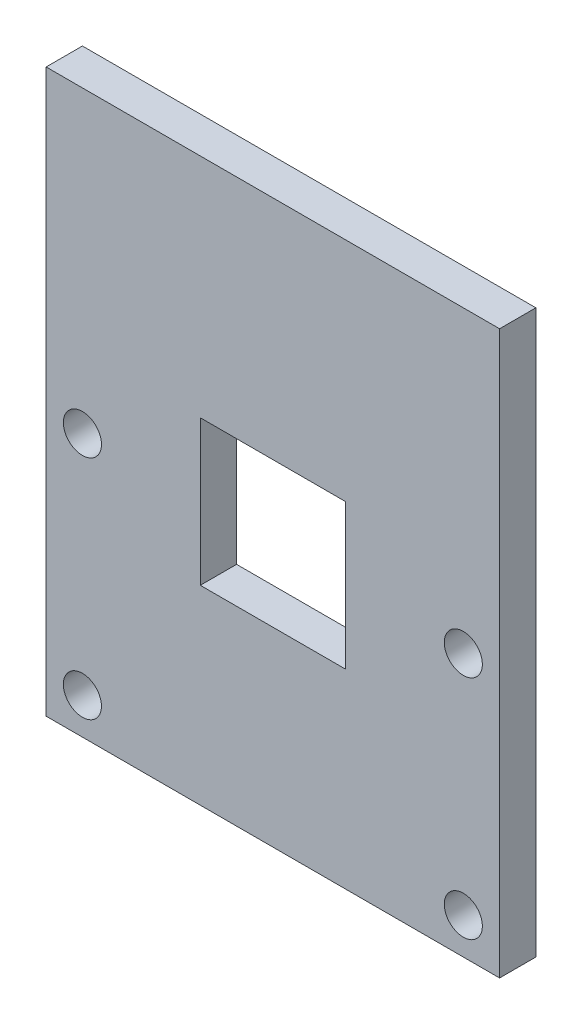
ISO-10303-21;
HEADER;
FILE_DESCRIPTION(('STEP AP214'),'2;1');
FILE_NAME('part.step','',(''),(''),'','','');
FILE_SCHEMA(('AUTOMOTIVE_DESIGN { 1 0 10303 214 1 1 1 1 }'));
ENDSEC;
DATA;
#1=APPLICATION_CONTEXT('core data for automotive mechanical design processes');
#2=APPLICATION_PROTOCOL_DEFINITION('international standard','automotive_design',2000,#1);
#3=PRODUCT_CONTEXT('',#1,'mechanical');
#4=PRODUCT('Part','Part','',(#3));
#5=PRODUCT_RELATED_PRODUCT_CATEGORY('part','',(#4));
#6=PRODUCT_DEFINITION_FORMATION('','',#4);
#7=PRODUCT_DEFINITION_CONTEXT('part definition',#1,'design');
#8=PRODUCT_DEFINITION('design','',#6,#7);
#9=PRODUCT_DEFINITION_SHAPE('','',#8);
#10=(LENGTH_UNIT() NAMED_UNIT(*) SI_UNIT(.MILLI.,.METRE.));
#11=(NAMED_UNIT(*) PLANE_ANGLE_UNIT() SI_UNIT($,.RADIAN.));
#12=(NAMED_UNIT(*) SI_UNIT($,.STERADIAN.) SOLID_ANGLE_UNIT());
#13=UNCERTAINTY_MEASURE_WITH_UNIT(LENGTH_MEASURE(1.E-05),#10,'distance_accuracy_value','');
#14=(GEOMETRIC_REPRESENTATION_CONTEXT(3) GLOBAL_UNCERTAINTY_ASSIGNED_CONTEXT((#13)) GLOBAL_UNIT_ASSIGNED_CONTEXT((#10,
#11,#12)) REPRESENTATION_CONTEXT('',''));
#15=CARTESIAN_POINT('',(0.,0.,0.));
#16=DIRECTION('',(0.,0.,1.));
#17=DIRECTION('',(1.,0.,0.));
#18=AXIS2_PLACEMENT_3D('',#15,#16,#17);
#19=CARTESIAN_POINT('',(0.,0.,2.));
#20=DIRECTION('',(0.,0.,1.));
#21=DIRECTION('',(1.,0.,0.));
#22=AXIS2_PLACEMENT_3D('',#19,#20,#21);
#23=PLANE('',#22);
#24=CARTESIAN_POINT('',(-30.2508523446474,-34.4951634409622,2.));
#25=DIRECTION('',(0.,0.,1.));
#26=DIRECTION('',(1.,0.,0.));
#27=AXIS2_PLACEMENT_3D('',#24,#25,#26);
#28=CIRCLE('',#27,1.05);
#29=CARTESIAN_POINT('',(-29.2008523446474,-34.4951634409622,2.));
#30=VERTEX_POINT('',#29);
#31=EDGE_CURVE('E161',#30,#30,#28,.T.);
#32=ORIENTED_EDGE('',*,*,#31,.F.);
#33=EDGE_LOOP('',(#32));
#34=FACE_BOUND('',#33,.T.);
#35=CARTESIAN_POINT('',(-30.2508523446474,-46.9951634409622,2.));
#36=DIRECTION('',(0.,0.,1.));
#37=DIRECTION('',(1.,0.,0.));
#38=AXIS2_PLACEMENT_3D('',#35,#36,#37);
#39=CIRCLE('',#38,1.05);
#40=CARTESIAN_POINT('',(-29.2008523446474,-46.9951634409622,2.));
#41=VERTEX_POINT('',#40);
#42=EDGE_CURVE('E177',#41,#41,#39,.T.);
#43=ORIENTED_EDGE('',*,*,#42,.F.);
#44=EDGE_LOOP('',(#43));
#45=FACE_BOUND('',#44,.T.);
#46=DIRECTION('',(0.,-1.,0.));
#47=VECTOR('',#46,1.);
#48=CARTESIAN_POINT('',(-32.2508523446474,-17.9951634409622,2.));
#49=LINE('',#48,#47);
#50=CARTESIAN_POINT('',(-32.2508523446474,-17.9951634409622,2.));
#51=VERTEX_POINT('',#50);
#52=CARTESIAN_POINT('',(-32.2508523446474,-48.9951634409622,2.));
#53=VERTEX_POINT('',#52);
#54=EDGE_CURVE('E185',#51,#53,#49,.T.);
#55=ORIENTED_EDGE('',*,*,#54,.T.);
#56=DIRECTION('',(1.,0.,0.));
#57=VECTOR('',#56,1.);
#58=CARTESIAN_POINT('',(-32.2508523446474,-48.9951634409622,2.));
#59=LINE('',#58,#57);
#60=CARTESIAN_POINT('',(-7.25085234464735,-48.9951634409622,2.));
#61=VERTEX_POINT('',#60);
#62=EDGE_CURVE('E189',#53,#61,#59,.T.);
#63=ORIENTED_EDGE('',*,*,#62,.T.);
#64=DIRECTION('',(0.,1.,0.));
#65=VECTOR('',#64,1.);
#66=CARTESIAN_POINT('',(-7.25085234464736,-17.9951634409622,2.));
#67=LINE('',#66,#65);
#68=CARTESIAN_POINT('',(-7.25085234464736,-17.9951634409622,2.));
#69=VERTEX_POINT('',#68);
#70=EDGE_CURVE('E193',#61,#69,#67,.T.);
#71=ORIENTED_EDGE('',*,*,#70,.T.);
#72=DIRECTION('',(-1.,0.,0.));
#73=VECTOR('',#72,1.);
#74=CARTESIAN_POINT('',(-32.2508523446474,-17.9951634409622,2.));
#75=LINE('',#74,#73);
#76=EDGE_CURVE('E196',#69,#51,#75,.T.);
#77=ORIENTED_EDGE('',*,*,#76,.T.);
#78=EDGE_LOOP('',(#55,#63,#71,#77));
#79=FACE_BOUND('',#78,.T.);
#80=CARTESIAN_POINT('',(-9.25085234464735,-46.9951634409622,2.));
#81=DIRECTION('',(0.,0.,1.));
#82=DIRECTION('',(1.,0.,0.));
#83=AXIS2_PLACEMENT_3D('',#80,#81,#82);
#84=CIRCLE('',#83,1.05);
#85=CARTESIAN_POINT('',(-8.20085234464735,-46.9951634409622,2.));
#86=VERTEX_POINT('',#85);
#87=EDGE_CURVE('E169',#86,#86,#84,.T.);
#88=ORIENTED_EDGE('',*,*,#87,.F.);
#89=EDGE_LOOP('',(#88));
#90=FACE_BOUND('',#89,.T.);
#91=CARTESIAN_POINT('',(-9.25085234464735,-34.4951634409622,2.));
#92=DIRECTION('',(0.,0.,1.));
#93=DIRECTION('',(1.,0.,0.));
#94=AXIS2_PLACEMENT_3D('',#91,#92,#93);
#95=CIRCLE('',#94,1.05);
#96=CARTESIAN_POINT('',(-8.20085234464735,-34.4951634409622,2.));
#97=VERTEX_POINT('',#96);
#98=EDGE_CURVE('E153',#97,#97,#95,.T.);
#99=ORIENTED_EDGE('',*,*,#98,.F.);
#100=EDGE_LOOP('',(#99));
#101=FACE_BOUND('',#100,.T.);
#102=DIRECTION('',(1.,0.,0.));
#103=VECTOR('',#102,1.);
#104=CARTESIAN_POINT('',(-23.7508523446474,-38.4951634409622,2.));
#105=LINE('',#104,#103);
#106=CARTESIAN_POINT('',(-23.7508523446474,-38.4951634409622,2.));
#107=VERTEX_POINT('',#106);
#108=CARTESIAN_POINT('',(-15.7508523446474,-38.4951634409622,2.));
#109=VERTEX_POINT('',#108);
#110=EDGE_CURVE('E114',#107,#109,#105,.T.);
#111=ORIENTED_EDGE('',*,*,#110,.F.);
#112=DIRECTION('',(0.,-1.,0.));
#113=VECTOR('',#112,1.);
#114=CARTESIAN_POINT('',(-23.7508523446474,-30.4951634409622,2.));
#115=LINE('',#114,#113);
#116=CARTESIAN_POINT('',(-23.7508523446474,-30.4951634409622,2.));
#117=VERTEX_POINT('',#116);
#118=EDGE_CURVE('E105',#117,#107,#115,.T.);
#119=ORIENTED_EDGE('',*,*,#118,.F.);
#120=DIRECTION('',(-1.,0.,0.));
#121=VECTOR('',#120,1.);
#122=CARTESIAN_POINT('',(-23.7508523446474,-30.4951634409622,2.));
#123=LINE('',#122,#121);
#124=CARTESIAN_POINT('',(-15.7508523446474,-30.4951634409622,2.));
#125=VERTEX_POINT('',#124);
#126=EDGE_CURVE('E131',#125,#117,#123,.T.);
#127=ORIENTED_EDGE('',*,*,#126,.F.);
#128=DIRECTION('',(0.,1.,0.));
#129=VECTOR('',#128,1.);
#130=CARTESIAN_POINT('',(-15.7508523446474,-30.4951634409622,2.));
#131=LINE('',#130,#129);
#132=EDGE_CURVE('E127',#109,#125,#131,.T.);
#133=ORIENTED_EDGE('',*,*,#132,.F.);
#134=EDGE_LOOP('',(#111,#119,#127,#133));
#135=FACE_BOUND('',#134,.T.);
#136=ADVANCED_FACE('F39',(#34,#45,#79,#90,#101,#135),#23,.T.);
#137=CARTESIAN_POINT('',(0.,0.,0.));
#138=DIRECTION('',(0.,0.,1.));
#139=DIRECTION('',(1.,0.,0.));
#140=AXIS2_PLACEMENT_3D('',#137,#138,#139);
#141=PLANE('',#140);
#142=CARTESIAN_POINT('',(-9.25085234464735,-34.4951634409622,0.));
#143=DIRECTION('',(0.,0.,1.));
#144=DIRECTION('',(1.,0.,0.));
#145=AXIS2_PLACEMENT_3D('',#142,#143,#144);
#146=CIRCLE('',#145,1.05);
#147=CARTESIAN_POINT('',(-8.20085234464735,-34.4951634409622,0.));
#148=VERTEX_POINT('',#147);
#149=EDGE_CURVE('E123',#148,#148,#146,.T.);
#150=ORIENTED_EDGE('',*,*,#149,.T.);
#151=EDGE_LOOP('',(#150));
#152=FACE_BOUND('',#151,.T.);
#153=CARTESIAN_POINT('',(-30.2508523446474,-34.4951634409622,0.));
#154=DIRECTION('',(0.,0.,1.));
#155=DIRECTION('',(1.,0.,0.));
#156=AXIS2_PLACEMENT_3D('',#153,#154,#155);
#157=CIRCLE('',#156,1.05);
#158=CARTESIAN_POINT('',(-29.2008523446474,-34.4951634409622,0.));
#159=VERTEX_POINT('',#158);
#160=EDGE_CURVE('E157',#159,#159,#157,.T.);
#161=ORIENTED_EDGE('',*,*,#160,.T.);
#162=EDGE_LOOP('',(#161));
#163=FACE_BOUND('',#162,.T.);
#164=CARTESIAN_POINT('',(-9.25085234464735,-46.9951634409622,0.));
#165=DIRECTION('',(0.,0.,1.));
#166=DIRECTION('',(1.,0.,0.));
#167=AXIS2_PLACEMENT_3D('',#164,#165,#166);
#168=CIRCLE('',#167,1.05);
#169=CARTESIAN_POINT('',(-8.20085234464735,-46.9951634409622,0.));
#170=VERTEX_POINT('',#169);
#171=EDGE_CURVE('E165',#170,#170,#168,.T.);
#172=ORIENTED_EDGE('',*,*,#171,.T.);
#173=EDGE_LOOP('',(#172));
#174=FACE_BOUND('',#173,.T.);
#175=CARTESIAN_POINT('',(-30.2508523446474,-46.9951634409622,0.));
#176=DIRECTION('',(0.,0.,1.));
#177=DIRECTION('',(1.,0.,0.));
#178=AXIS2_PLACEMENT_3D('',#175,#176,#177);
#179=CIRCLE('',#178,1.05);
#180=CARTESIAN_POINT('',(-29.2008523446474,-46.9951634409622,0.));
#181=VERTEX_POINT('',#180);
#182=EDGE_CURVE('E173',#181,#181,#179,.T.);
#183=ORIENTED_EDGE('',*,*,#182,.T.);
#184=EDGE_LOOP('',(#183));
#185=FACE_BOUND('',#184,.T.);
#186=DIRECTION('',(0.,-1.,0.));
#187=VECTOR('',#186,1.);
#188=CARTESIAN_POINT('',(-32.2508523446474,-17.9951634409622,0.));
#189=LINE('',#188,#187);
#190=CARTESIAN_POINT('',(-32.2508523446474,-17.9951634409622,0.));
#191=VERTEX_POINT('',#190);
#192=CARTESIAN_POINT('',(-32.2508523446474,-48.9951634409622,0.));
#193=VERTEX_POINT('',#192);
#194=EDGE_CURVE('E181',#191,#193,#189,.T.);
#195=ORIENTED_EDGE('',*,*,#194,.F.);
#196=DIRECTION('',(-1.,0.,0.));
#197=VECTOR('',#196,1.);
#198=CARTESIAN_POINT('',(-32.2508523446474,-17.9951634409622,0.));
#199=LINE('',#198,#197);
#200=CARTESIAN_POINT('',(-7.25085234464736,-17.9951634409622,0.));
#201=VERTEX_POINT('',#200);
#202=EDGE_CURVE('E190',#201,#191,#199,.T.);
#203=ORIENTED_EDGE('',*,*,#202,.F.);
#204=DIRECTION('',(0.,1.,0.));
#205=VECTOR('',#204,1.);
#206=CARTESIAN_POINT('',(-7.25085234464736,-17.9951634409622,0.));
#207=LINE('',#206,#205);
#208=CARTESIAN_POINT('',(-7.25085234464735,-48.9951634409622,0.));
#209=VERTEX_POINT('',#208);
#210=EDGE_CURVE('E206',#209,#201,#207,.T.);
#211=ORIENTED_EDGE('',*,*,#210,.F.);
#212=DIRECTION('',(1.,0.,0.));
#213=VECTOR('',#212,1.);
#214=CARTESIAN_POINT('',(-32.2508523446474,-48.9951634409622,0.));
#215=LINE('',#214,#213);
#216=EDGE_CURVE('E203',#193,#209,#215,.T.);
#217=ORIENTED_EDGE('',*,*,#216,.F.);
#218=EDGE_LOOP('',(#195,#203,#211,#217));
#219=FACE_BOUND('',#218,.T.);
#220=DIRECTION('',(0.,-1.,0.));
#221=VECTOR('',#220,1.);
#222=CARTESIAN_POINT('',(-23.7508523446474,-30.4951634409622,0.));
#223=LINE('',#222,#221);
#224=CARTESIAN_POINT('',(-23.7508523446474,-30.4951634409622,0.));
#225=VERTEX_POINT('',#224);
#226=CARTESIAN_POINT('',(-23.7508523446474,-38.4951634409622,0.));
#227=VERTEX_POINT('',#226);
#228=EDGE_CURVE('E63',#225,#227,#223,.T.);
#229=ORIENTED_EDGE('',*,*,#228,.T.);
#230=DIRECTION('',(1.,0.,0.));
#231=VECTOR('',#230,1.);
#232=CARTESIAN_POINT('',(-23.7508523446474,-38.4951634409622,0.));
#233=LINE('',#232,#231);
#234=CARTESIAN_POINT('',(-15.7508523446474,-38.4951634409622,0.));
#235=VERTEX_POINT('',#234);
#236=EDGE_CURVE('E121',#227,#235,#233,.T.);
#237=ORIENTED_EDGE('',*,*,#236,.T.);
#238=DIRECTION('',(0.,1.,0.));
#239=VECTOR('',#238,1.);
#240=CARTESIAN_POINT('',(-15.7508523446474,-30.4951634409622,0.));
#241=LINE('',#240,#239);
#242=CARTESIAN_POINT('',(-15.7508523446474,-30.4951634409622,0.));
#243=VERTEX_POINT('',#242);
#244=EDGE_CURVE('E140',#235,#243,#241,.T.);
#245=ORIENTED_EDGE('',*,*,#244,.T.);
#246=DIRECTION('',(-1.,0.,0.));
#247=VECTOR('',#246,1.);
#248=CARTESIAN_POINT('',(-23.7508523446474,-30.4951634409622,0.));
#249=LINE('',#248,#247);
#250=EDGE_CURVE('E115',#243,#225,#249,.T.);
#251=ORIENTED_EDGE('',*,*,#250,.T.);
#252=EDGE_LOOP('',(#229,#237,#245,#251));
#253=FACE_BOUND('',#252,.T.);
#254=ADVANCED_FACE('F229',(#152,#163,#174,#185,#219,#253),#141,.F.);
#255=CARTESIAN_POINT('',(-32.2508523446474,-17.9951634409622,2.));
#256=DIRECTION('',(1.,0.,0.));
#257=DIRECTION('',(0.,1.,0.));
#258=AXIS2_PLACEMENT_3D('',#255,#256,#257);
#259=PLANE('',#258);
#260=ORIENTED_EDGE('',*,*,#194,.T.);
#261=DIRECTION('',(0.,0.,-1.));
#262=VECTOR('',#261,1.);
#263=CARTESIAN_POINT('',(-32.2508523446474,-48.9951634409622,2.));
#264=LINE('',#263,#262);
#265=EDGE_CURVE('E11',#53,#193,#264,.T.);
#266=ORIENTED_EDGE('',*,*,#265,.F.);
#267=ORIENTED_EDGE('',*,*,#54,.F.);
#268=DIRECTION('',(0.,0.,-1.));
#269=VECTOR('',#268,1.);
#270=CARTESIAN_POINT('',(-32.2508523446474,-17.9951634409622,2.));
#271=LINE('',#270,#269);
#272=EDGE_CURVE('E199',#51,#191,#271,.T.);
#273=ORIENTED_EDGE('',*,*,#272,.T.);
#274=EDGE_LOOP('',(#260,#266,#267,#273));
#275=FACE_BOUND('',#274,.T.);
#276=ADVANCED_FACE('F41',(#275),#259,.F.);
#277=CARTESIAN_POINT('',(-32.2508523446474,-48.9951634409622,2.));
#278=DIRECTION('',(0.,1.,0.));
#279=DIRECTION('',(0.,0.,1.));
#280=AXIS2_PLACEMENT_3D('',#277,#278,#279);
#281=PLANE('',#280);
#282=ORIENTED_EDGE('',*,*,#216,.T.);
#283=DIRECTION('',(0.,0.,-1.));
#284=VECTOR('',#283,1.);
#285=CARTESIAN_POINT('',(-7.25085234464735,-48.9951634409622,2.));
#286=LINE('',#285,#284);
#287=EDGE_CURVE('E48',#61,#209,#286,.T.);
#288=ORIENTED_EDGE('',*,*,#287,.F.);
#289=ORIENTED_EDGE('',*,*,#62,.F.);
#290=ORIENTED_EDGE('',*,*,#265,.T.);
#291=EDGE_LOOP('',(#282,#288,#289,#290));
#292=FACE_BOUND('',#291,.T.);
#293=ADVANCED_FACE('F240',(#292),#281,.F.);
#294=CARTESIAN_POINT('',(-7.25085234464736,-17.9951634409622,2.));
#295=DIRECTION('',(-1.,0.,0.));
#296=DIRECTION('',(0.,-1.,0.));
#297=AXIS2_PLACEMENT_3D('',#294,#295,#296);
#298=PLANE('',#297);
#299=ORIENTED_EDGE('',*,*,#210,.T.);
#300=DIRECTION('',(0.,0.,-1.));
#301=VECTOR('',#300,1.);
#302=CARTESIAN_POINT('',(-7.25085234464736,-17.9951634409622,2.));
#303=LINE('',#302,#301);
#304=EDGE_CURVE('E214',#69,#201,#303,.T.);
#305=ORIENTED_EDGE('',*,*,#304,.F.);
#306=ORIENTED_EDGE('',*,*,#70,.F.);
#307=ORIENTED_EDGE('',*,*,#287,.T.);
#308=EDGE_LOOP('',(#299,#305,#306,#307));
#309=FACE_BOUND('',#308,.T.);
#310=ADVANCED_FACE('F223',(#309),#298,.F.);
#311=CARTESIAN_POINT('',(-32.2508523446474,-17.9951634409622,2.));
#312=DIRECTION('',(0.,-1.,0.));
#313=DIRECTION('',(0.,0.,-1.));
#314=AXIS2_PLACEMENT_3D('',#311,#312,#313);
#315=PLANE('',#314);
#316=ORIENTED_EDGE('',*,*,#202,.T.);
#317=ORIENTED_EDGE('',*,*,#272,.F.);
#318=ORIENTED_EDGE('',*,*,#76,.F.);
#319=ORIENTED_EDGE('',*,*,#304,.T.);
#320=EDGE_LOOP('',(#316,#317,#318,#319));
#321=FACE_BOUND('',#320,.T.);
#322=ADVANCED_FACE('F233',(#321),#315,.F.);
#323=CARTESIAN_POINT('',(-30.2508523446474,-46.9951634409622,2.));
#324=DIRECTION('',(0.,0.,-1.));
#325=DIRECTION('',(-1.,0.,0.));
#326=AXIS2_PLACEMENT_3D('',#323,#324,#325);
#327=CYLINDRICAL_SURFACE('',#326,1.05);
#328=ORIENTED_EDGE('',*,*,#42,.T.);
#329=EDGE_LOOP('',(#328));
#330=FACE_BOUND('',#329,.T.);
#331=ORIENTED_EDGE('',*,*,#182,.F.);
#332=EDGE_LOOP('',(#331));
#333=FACE_BOUND('',#332,.T.);
#334=ADVANCED_FACE('F258',(#330,#333),#327,.F.);
#335=CARTESIAN_POINT('',(-9.25085234464735,-46.9951634409622,2.));
#336=DIRECTION('',(0.,0.,-1.));
#337=DIRECTION('',(-1.,0.,0.));
#338=AXIS2_PLACEMENT_3D('',#335,#336,#337);
#339=CYLINDRICAL_SURFACE('',#338,1.05);
#340=ORIENTED_EDGE('',*,*,#87,.T.);
#341=EDGE_LOOP('',(#340));
#342=FACE_BOUND('',#341,.T.);
#343=ORIENTED_EDGE('',*,*,#171,.F.);
#344=EDGE_LOOP('',(#343));
#345=FACE_BOUND('',#344,.T.);
#346=ADVANCED_FACE('F265',(#342,#345),#339,.F.);
#347=CARTESIAN_POINT('',(-30.2508523446474,-34.4951634409622,2.));
#348=DIRECTION('',(0.,0.,-1.));
#349=DIRECTION('',(-1.,0.,0.));
#350=AXIS2_PLACEMENT_3D('',#347,#348,#349);
#351=CYLINDRICAL_SURFACE('',#350,1.05);
#352=ORIENTED_EDGE('',*,*,#31,.T.);
#353=EDGE_LOOP('',(#352));
#354=FACE_BOUND('',#353,.T.);
#355=ORIENTED_EDGE('',*,*,#160,.F.);
#356=EDGE_LOOP('',(#355));
#357=FACE_BOUND('',#356,.T.);
#358=ADVANCED_FACE('F270',(#354,#357),#351,.F.);
#359=CARTESIAN_POINT('',(-9.25085234464735,-34.4951634409622,2.));
#360=DIRECTION('',(0.,0.,-1.));
#361=DIRECTION('',(-1.,0.,0.));
#362=AXIS2_PLACEMENT_3D('',#359,#360,#361);
#363=CYLINDRICAL_SURFACE('',#362,1.05);
#364=ORIENTED_EDGE('',*,*,#98,.T.);
#365=EDGE_LOOP('',(#364));
#366=FACE_BOUND('',#365,.T.);
#367=ORIENTED_EDGE('',*,*,#149,.F.);
#368=EDGE_LOOP('',(#367));
#369=FACE_BOUND('',#368,.T.);
#370=ADVANCED_FACE('F279',(#366,#369),#363,.F.);
#371=CARTESIAN_POINT('',(-23.7508523446474,-30.4951634409622,2.));
#372=DIRECTION('',(1.,0.,0.));
#373=DIRECTION('',(0.,0.,-1.));
#374=AXIS2_PLACEMENT_3D('',#371,#372,#373);
#375=PLANE('',#374);
#376=ORIENTED_EDGE('',*,*,#228,.F.);
#377=DIRECTION('',(0.,0.,-1.));
#378=VECTOR('',#377,1.);
#379=CARTESIAN_POINT('',(-23.7508523446474,-30.4951634409622,2.));
#380=LINE('',#379,#378);
#381=EDGE_CURVE('E109',#117,#225,#380,.T.);
#382=ORIENTED_EDGE('',*,*,#381,.F.);
#383=ORIENTED_EDGE('',*,*,#118,.T.);
#384=DIRECTION('',(0.,0.,-1.));
#385=VECTOR('',#384,1.);
#386=CARTESIAN_POINT('',(-23.7508523446474,-38.4951634409622,2.));
#387=LINE('',#386,#385);
#388=EDGE_CURVE('E108',#107,#227,#387,.T.);
#389=ORIENTED_EDGE('',*,*,#388,.T.);
#390=EDGE_LOOP('',(#376,#382,#383,#389));
#391=FACE_BOUND('',#390,.T.);
#392=ADVANCED_FACE('F107',(#391),#375,.T.);
#393=CARTESIAN_POINT('',(-23.7508523446474,-38.4951634409622,2.));
#394=DIRECTION('',(0.,1.,0.));
#395=DIRECTION('',(0.,0.,1.));
#396=AXIS2_PLACEMENT_3D('',#393,#394,#395);
#397=PLANE('',#396);
#398=ORIENTED_EDGE('',*,*,#236,.F.);
#399=ORIENTED_EDGE('',*,*,#388,.F.);
#400=ORIENTED_EDGE('',*,*,#110,.T.);
#401=DIRECTION('',(0.,0.,-1.));
#402=VECTOR('',#401,1.);
#403=CARTESIAN_POINT('',(-15.7508523446474,-38.4951634409622,2.));
#404=LINE('',#403,#402);
#405=EDGE_CURVE('E124',#109,#235,#404,.T.);
#406=ORIENTED_EDGE('',*,*,#405,.T.);
#407=EDGE_LOOP('',(#398,#399,#400,#406));
#408=FACE_BOUND('',#407,.T.);
#409=ADVANCED_FACE('F118',(#408),#397,.T.);
#410=CARTESIAN_POINT('',(-15.7508523446474,-30.4951634409622,2.));
#411=DIRECTION('',(-1.,0.,0.));
#412=DIRECTION('',(0.,0.,1.));
#413=AXIS2_PLACEMENT_3D('',#410,#411,#412);
#414=PLANE('',#413);
#415=ORIENTED_EDGE('',*,*,#244,.F.);
#416=ORIENTED_EDGE('',*,*,#405,.F.);
#417=ORIENTED_EDGE('',*,*,#132,.T.);
#418=DIRECTION('',(0.,0.,-1.));
#419=VECTOR('',#418,1.);
#420=CARTESIAN_POINT('',(-15.7508523446474,-30.4951634409622,2.));
#421=LINE('',#420,#419);
#422=EDGE_CURVE('E55',#125,#243,#421,.T.);
#423=ORIENTED_EDGE('',*,*,#422,.T.);
#424=EDGE_LOOP('',(#415,#416,#417,#423));
#425=FACE_BOUND('',#424,.T.);
#426=ADVANCED_FACE('F291',(#425),#414,.T.);
#427=CARTESIAN_POINT('',(-23.7508523446474,-30.4951634409622,2.));
#428=DIRECTION('',(0.,-1.,0.));
#429=DIRECTION('',(0.,0.,-1.));
#430=AXIS2_PLACEMENT_3D('',#427,#428,#429);
#431=PLANE('',#430);
#432=ORIENTED_EDGE('',*,*,#250,.F.);
#433=ORIENTED_EDGE('',*,*,#422,.F.);
#434=ORIENTED_EDGE('',*,*,#126,.T.);
#435=ORIENTED_EDGE('',*,*,#381,.T.);
#436=EDGE_LOOP('',(#432,#433,#434,#435));
#437=FACE_BOUND('',#436,.T.);
#438=ADVANCED_FACE('F294',(#437),#431,.T.);
#439=CLOSED_SHELL('',(#136,#254,#276,#293,#310,#322,#334,#346,#358,#370,#392,#409,#426,#438));
#440=MANIFOLD_SOLID_BREP('B2',#439);
#441=ADVANCED_BREP_SHAPE_REPRESENTATION('',(#18,#440),#14);
#442=SHAPE_DEFINITION_REPRESENTATION(#9,#441);
ENDSEC;
END-ISO-10303-21;
